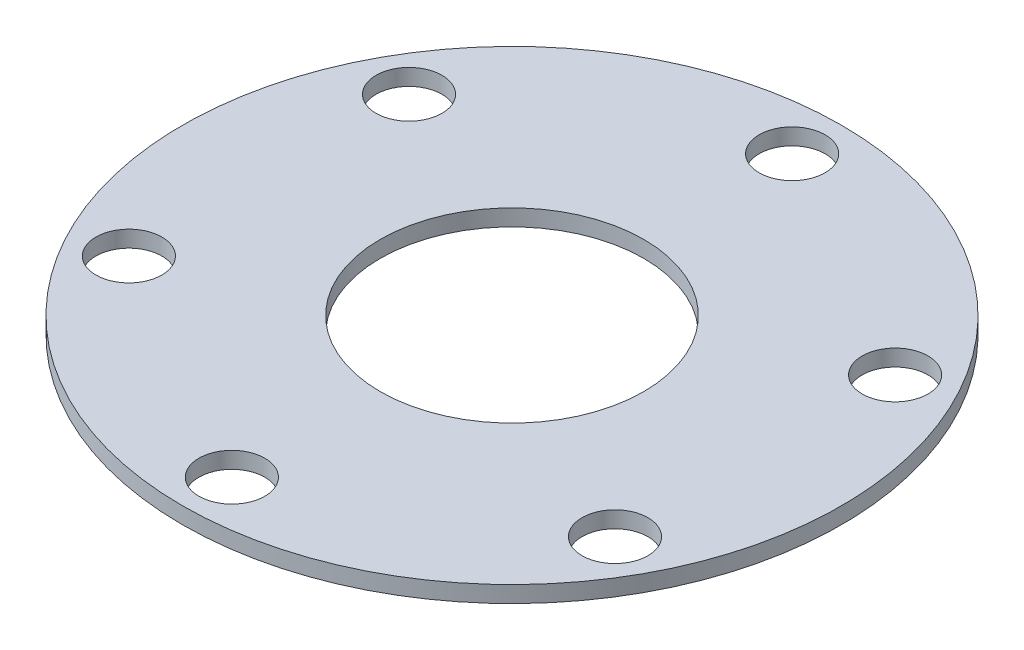
ISO-10303-21;
HEADER;
FILE_DESCRIPTION(('STEP AP214'),'2;1');
FILE_NAME('part.step','',(''),(''),'','','');
FILE_SCHEMA(('AUTOMOTIVE_DESIGN { 1 0 10303 214 1 1 1 1 }'));
ENDSEC;
DATA;
#1=APPLICATION_CONTEXT('core data for automotive mechanical design processes');
#2=APPLICATION_PROTOCOL_DEFINITION('international standard','automotive_design',2000,#1);
#3=PRODUCT_CONTEXT('',#1,'mechanical');
#4=PRODUCT('Part','Part','',(#3));
#5=PRODUCT_RELATED_PRODUCT_CATEGORY('part','',(#4));
#6=PRODUCT_DEFINITION_FORMATION('','',#4);
#7=PRODUCT_DEFINITION_CONTEXT('part definition',#1,'design');
#8=PRODUCT_DEFINITION('design','',#6,#7);
#9=PRODUCT_DEFINITION_SHAPE('','',#8);
#10=(LENGTH_UNIT() NAMED_UNIT(*) SI_UNIT(.MILLI.,.METRE.));
#11=(NAMED_UNIT(*) PLANE_ANGLE_UNIT() SI_UNIT($,.RADIAN.));
#12=(NAMED_UNIT(*) SI_UNIT($,.STERADIAN.) SOLID_ANGLE_UNIT());
#13=UNCERTAINTY_MEASURE_WITH_UNIT(LENGTH_MEASURE(1.E-05),#10,'distance_accuracy_value','');
#14=(GEOMETRIC_REPRESENTATION_CONTEXT(3) GLOBAL_UNCERTAINTY_ASSIGNED_CONTEXT((#13)) GLOBAL_UNIT_ASSIGNED_CONTEXT((#10,
#11,#12)) REPRESENTATION_CONTEXT('',''));
#15=CARTESIAN_POINT('',(0.,0.,0.));
#16=DIRECTION('',(0.,0.,1.));
#17=DIRECTION('',(1.,0.,0.));
#18=AXIS2_PLACEMENT_3D('',#15,#16,#17);
#19=CARTESIAN_POINT('',(0.,6.35,0.));
#20=DIRECTION('',(0.,-1.,0.));
#21=DIRECTION('',(0.,0.,-1.));
#22=AXIS2_PLACEMENT_3D('',#19,#20,#21);
#23=CYLINDRICAL_SURFACE('',#22,127.);
#24=CARTESIAN_POINT('',(0.,6.35,0.));
#25=DIRECTION('',(0.,1.,0.));
#26=DIRECTION('',(0.,0.,1.));
#27=AXIS2_PLACEMENT_3D('',#24,#25,#26);
#28=CIRCLE('',#27,127.);
#29=CARTESIAN_POINT('',(0.,6.35,127.));
#30=VERTEX_POINT('',#29);
#31=EDGE_CURVE('E10',#30,#30,#28,.T.);
#32=ORIENTED_EDGE('',*,*,#31,.F.);
#33=EDGE_LOOP('',(#32));
#34=FACE_BOUND('',#33,.T.);
#35=CARTESIAN_POINT('',(0.,0.,0.));
#36=DIRECTION('',(0.,1.,0.));
#37=DIRECTION('',(0.,0.,1.));
#38=AXIS2_PLACEMENT_3D('',#35,#36,#37);
#39=CIRCLE('',#38,127.);
#40=CARTESIAN_POINT('',(0.,0.,127.));
#41=VERTEX_POINT('',#40);
#42=EDGE_CURVE('E38',#41,#41,#39,.T.);
#43=ORIENTED_EDGE('',*,*,#42,.T.);
#44=EDGE_LOOP('',(#43));
#45=FACE_BOUND('',#44,.T.);
#46=ADVANCED_FACE('F31',(#34,#45),#23,.T.);
#47=CARTESIAN_POINT('',(0.,6.35,0.));
#48=DIRECTION('',(0.,1.,0.));
#49=DIRECTION('',(0.,0.,1.));
#50=AXIS2_PLACEMENT_3D('',#47,#48,#49);
#51=PLANE('',#50);
#52=CARTESIAN_POINT('',(0.,6.35,-107.95));
#53=DIRECTION('',(0.,1.,0.));
#54=DIRECTION('',(0.,0.,1.));
#55=AXIS2_PLACEMENT_3D('',#52,#53,#54);
#56=CIRCLE('',#55,12.7);
#57=CARTESIAN_POINT('',(0.,6.35,-95.25));
#58=VERTEX_POINT('',#57);
#59=EDGE_CURVE('E53',#58,#58,#56,.T.);
#60=ORIENTED_EDGE('',*,*,#59,.F.);
#61=EDGE_LOOP('',(#60));
#62=FACE_BOUND('',#61,.T.);
#63=CARTESIAN_POINT('',(93.6625,6.35,53.975));
#64=DIRECTION('',(0.,1.,0.));
#65=DIRECTION('',(0.,0.,1.));
#66=AXIS2_PLACEMENT_3D('',#63,#64,#65);
#67=CIRCLE('',#66,12.7);
#68=CARTESIAN_POINT('',(93.6625,6.35,66.675));
#69=VERTEX_POINT('',#68);
#70=EDGE_CURVE('E79',#69,#69,#67,.T.);
#71=ORIENTED_EDGE('',*,*,#70,.F.);
#72=EDGE_LOOP('',(#71));
#73=FACE_BOUND('',#72,.T.);
#74=CARTESIAN_POINT('',(-93.6625,6.35,53.975));
#75=DIRECTION('',(0.,1.,0.));
#76=DIRECTION('',(0.,0.,1.));
#77=AXIS2_PLACEMENT_3D('',#74,#75,#76);
#78=CIRCLE('',#77,12.7);
#79=CARTESIAN_POINT('',(-93.6625,6.35,66.675));
#80=VERTEX_POINT('',#79);
#81=EDGE_CURVE('E75',#80,#80,#78,.T.);
#82=ORIENTED_EDGE('',*,*,#81,.F.);
#83=EDGE_LOOP('',(#82));
#84=FACE_BOUND('',#83,.T.);
#85=CARTESIAN_POINT('',(-93.6625,6.35,-53.975));
#86=DIRECTION('',(0.,1.,0.));
#87=DIRECTION('',(0.,0.,1.));
#88=AXIS2_PLACEMENT_3D('',#85,#86,#87);
#89=CIRCLE('',#88,12.7);
#90=CARTESIAN_POINT('',(-93.6625,6.35,-41.275));
#91=VERTEX_POINT('',#90);
#92=EDGE_CURVE('E78',#91,#91,#89,.T.);
#93=ORIENTED_EDGE('',*,*,#92,.F.);
#94=EDGE_LOOP('',(#93));
#95=FACE_BOUND('',#94,.T.);
#96=CARTESIAN_POINT('',(0.,6.35,107.95));
#97=DIRECTION('',(0.,1.,0.));
#98=DIRECTION('',(0.,0.,1.));
#99=AXIS2_PLACEMENT_3D('',#96,#97,#98);
#100=CIRCLE('',#99,12.7);
#101=CARTESIAN_POINT('',(0.,6.35,120.65));
#102=VERTEX_POINT('',#101);
#103=EDGE_CURVE('E82',#102,#102,#100,.T.);
#104=ORIENTED_EDGE('',*,*,#103,.F.);
#105=EDGE_LOOP('',(#104));
#106=FACE_BOUND('',#105,.T.);
#107=CARTESIAN_POINT('',(93.6625,6.35,-53.975));
#108=DIRECTION('',(0.,1.,0.));
#109=DIRECTION('',(0.,0.,1.));
#110=AXIS2_PLACEMENT_3D('',#107,#108,#109);
#111=CIRCLE('',#110,12.7);
#112=CARTESIAN_POINT('',(93.6625,6.35,-41.275));
#113=VERTEX_POINT('',#112);
#114=EDGE_CURVE('E85',#113,#113,#111,.T.);
#115=ORIENTED_EDGE('',*,*,#114,.F.);
#116=EDGE_LOOP('',(#115));
#117=FACE_BOUND('',#116,.T.);
#118=CARTESIAN_POINT('',(0.,6.35,0.));
#119=DIRECTION('',(0.,1.,0.));
#120=DIRECTION('',(0.,0.,1.));
#121=AXIS2_PLACEMENT_3D('',#118,#119,#120);
#122=CIRCLE('',#121,50.8);
#123=CARTESIAN_POINT('',(0.,6.35,50.8));
#124=VERTEX_POINT('',#123);
#125=EDGE_CURVE('E46',#124,#124,#122,.T.);
#126=ORIENTED_EDGE('',*,*,#125,.F.);
#127=EDGE_LOOP('',(#126));
#128=FACE_BOUND('',#127,.T.);
#129=ORIENTED_EDGE('',*,*,#31,.T.);
#130=EDGE_LOOP('',(#129));
#131=FACE_BOUND('',#130,.T.);
#132=ADVANCED_FACE('F96',(#62,#73,#84,#95,#106,#117,#128,#131),#51,.T.);
#133=CARTESIAN_POINT('',(0.,0.,0.));
#134=DIRECTION('',(0.,1.,0.));
#135=DIRECTION('',(0.,0.,1.));
#136=AXIS2_PLACEMENT_3D('',#133,#134,#135);
#137=PLANE('',#136);
#138=CARTESIAN_POINT('',(0.,0.,-107.95));
#139=DIRECTION('',(0.,1.,0.));
#140=DIRECTION('',(0.,0.,1.));
#141=AXIS2_PLACEMENT_3D('',#138,#139,#140);
#142=CIRCLE('',#141,12.7);
#143=CARTESIAN_POINT('',(0.,0.,-95.25));
#144=VERTEX_POINT('',#143);
#145=EDGE_CURVE('E34',#144,#144,#142,.T.);
#146=ORIENTED_EDGE('',*,*,#145,.T.);
#147=EDGE_LOOP('',(#146));
#148=FACE_BOUND('',#147,.T.);
#149=CARTESIAN_POINT('',(93.6625,0.,53.975));
#150=DIRECTION('',(0.,1.,0.));
#151=DIRECTION('',(0.,0.,1.));
#152=AXIS2_PLACEMENT_3D('',#149,#150,#151);
#153=CIRCLE('',#152,12.7);
#154=CARTESIAN_POINT('',(93.6625,0.,66.675));
#155=VERTEX_POINT('',#154);
#156=EDGE_CURVE('E61',#155,#155,#153,.T.);
#157=ORIENTED_EDGE('',*,*,#156,.T.);
#158=EDGE_LOOP('',(#157));
#159=FACE_BOUND('',#158,.T.);
#160=CARTESIAN_POINT('',(-93.6625,0.,53.975));
#161=DIRECTION('',(0.,1.,0.));
#162=DIRECTION('',(0.,0.,1.));
#163=AXIS2_PLACEMENT_3D('',#160,#161,#162);
#164=CIRCLE('',#163,12.7);
#165=CARTESIAN_POINT('',(-93.6625,0.,66.675));
#166=VERTEX_POINT('',#165);
#167=EDGE_CURVE('E59',#166,#166,#164,.T.);
#168=ORIENTED_EDGE('',*,*,#167,.T.);
#169=EDGE_LOOP('',(#168));
#170=FACE_BOUND('',#169,.T.);
#171=CARTESIAN_POINT('',(-93.6625,0.,-53.975));
#172=DIRECTION('',(0.,1.,0.));
#173=DIRECTION('',(0.,0.,1.));
#174=AXIS2_PLACEMENT_3D('',#171,#172,#173);
#175=CIRCLE('',#174,12.7);
#176=CARTESIAN_POINT('',(-93.6625,0.,-41.275));
#177=VERTEX_POINT('',#176);
#178=EDGE_CURVE('E56',#177,#177,#175,.T.);
#179=ORIENTED_EDGE('',*,*,#178,.T.);
#180=EDGE_LOOP('',(#179));
#181=FACE_BOUND('',#180,.T.);
#182=CARTESIAN_POINT('',(0.,0.,107.95));
#183=DIRECTION('',(0.,1.,0.));
#184=DIRECTION('',(0.,0.,1.));
#185=AXIS2_PLACEMENT_3D('',#182,#183,#184);
#186=CIRCLE('',#185,12.7);
#187=CARTESIAN_POINT('',(0.,0.,120.65));
#188=VERTEX_POINT('',#187);
#189=EDGE_CURVE('E52',#188,#188,#186,.T.);
#190=ORIENTED_EDGE('',*,*,#189,.T.);
#191=EDGE_LOOP('',(#190));
#192=FACE_BOUND('',#191,.T.);
#193=CARTESIAN_POINT('',(93.6625,0.,-53.975));
#194=DIRECTION('',(0.,1.,0.));
#195=DIRECTION('',(0.,0.,1.));
#196=AXIS2_PLACEMENT_3D('',#193,#194,#195);
#197=CIRCLE('',#196,12.7);
#198=CARTESIAN_POINT('',(93.6625,0.,-41.275));
#199=VERTEX_POINT('',#198);
#200=EDGE_CURVE('E49',#199,#199,#197,.T.);
#201=ORIENTED_EDGE('',*,*,#200,.T.);
#202=EDGE_LOOP('',(#201));
#203=FACE_BOUND('',#202,.T.);
#204=CARTESIAN_POINT('',(0.,0.,0.));
#205=DIRECTION('',(0.,1.,0.));
#206=DIRECTION('',(0.,0.,1.));
#207=AXIS2_PLACEMENT_3D('',#204,#205,#206);
#208=CIRCLE('',#207,50.8);
#209=CARTESIAN_POINT('',(0.,0.,50.8));
#210=VERTEX_POINT('',#209);
#211=EDGE_CURVE('E43',#210,#210,#208,.T.);
#212=ORIENTED_EDGE('',*,*,#211,.T.);
#213=EDGE_LOOP('',(#212));
#214=FACE_BOUND('',#213,.T.);
#215=ORIENTED_EDGE('',*,*,#42,.F.);
#216=EDGE_LOOP('',(#215));
#217=FACE_BOUND('',#216,.T.);
#218=ADVANCED_FACE('F99',(#148,#159,#170,#181,#192,#203,#214,#217),#137,.F.);
#219=CARTESIAN_POINT('',(0.,0.,0.));
#220=DIRECTION('',(0.,1.,0.));
#221=DIRECTION('',(0.,0.,1.));
#222=AXIS2_PLACEMENT_3D('',#219,#220,#221);
#223=CYLINDRICAL_SURFACE('',#222,50.8);
#224=ORIENTED_EDGE('',*,*,#211,.F.);
#225=EDGE_LOOP('',(#224));
#226=FACE_BOUND('',#225,.T.);
#227=ORIENTED_EDGE('',*,*,#125,.T.);
#228=EDGE_LOOP('',(#227));
#229=FACE_BOUND('',#228,.T.);
#230=ADVANCED_FACE('F116',(#226,#229),#223,.F.);
#231=CARTESIAN_POINT('',(93.6625,-6.35,-53.975));
#232=DIRECTION('',(0.,1.,0.));
#233=DIRECTION('',(0.,0.,1.));
#234=AXIS2_PLACEMENT_3D('',#231,#232,#233);
#235=CYLINDRICAL_SURFACE('',#234,12.7);
#236=ORIENTED_EDGE('',*,*,#114,.T.);
#237=EDGE_LOOP('',(#236));
#238=FACE_BOUND('',#237,.T.);
#239=ORIENTED_EDGE('',*,*,#200,.F.);
#240=EDGE_LOOP('',(#239));
#241=FACE_BOUND('',#240,.T.);
#242=ADVANCED_FACE('F112',(#238,#241),#235,.F.);
#243=CARTESIAN_POINT('',(0.,-6.35,107.95));
#244=DIRECTION('',(0.,1.,0.));
#245=DIRECTION('',(0.,0.,1.));
#246=AXIS2_PLACEMENT_3D('',#243,#244,#245);
#247=CYLINDRICAL_SURFACE('',#246,12.7);
#248=ORIENTED_EDGE('',*,*,#103,.T.);
#249=EDGE_LOOP('',(#248));
#250=FACE_BOUND('',#249,.T.);
#251=ORIENTED_EDGE('',*,*,#189,.F.);
#252=EDGE_LOOP('',(#251));
#253=FACE_BOUND('',#252,.T.);
#254=ADVANCED_FACE('F115',(#250,#253),#247,.F.);
#255=CARTESIAN_POINT('',(-93.6625,-6.35,-53.975));
#256=DIRECTION('',(0.,1.,0.));
#257=DIRECTION('',(0.,0.,1.));
#258=AXIS2_PLACEMENT_3D('',#255,#256,#257);
#259=CYLINDRICAL_SURFACE('',#258,12.7);
#260=ORIENTED_EDGE('',*,*,#92,.T.);
#261=EDGE_LOOP('',(#260));
#262=FACE_BOUND('',#261,.T.);
#263=ORIENTED_EDGE('',*,*,#178,.F.);
#264=EDGE_LOOP('',(#263));
#265=FACE_BOUND('',#264,.T.);
#266=ADVANCED_FACE('F153',(#262,#265),#259,.F.);
#267=CARTESIAN_POINT('',(-93.6625,-6.35,53.975));
#268=DIRECTION('',(0.,1.,0.));
#269=DIRECTION('',(0.,0.,1.));
#270=AXIS2_PLACEMENT_3D('',#267,#268,#269);
#271=CYLINDRICAL_SURFACE('',#270,12.7);
#272=ORIENTED_EDGE('',*,*,#81,.T.);
#273=EDGE_LOOP('',(#272));
#274=FACE_BOUND('',#273,.T.);
#275=ORIENTED_EDGE('',*,*,#167,.F.);
#276=EDGE_LOOP('',(#275));
#277=FACE_BOUND('',#276,.T.);
#278=ADVANCED_FACE('F161',(#274,#277),#271,.F.);
#279=CARTESIAN_POINT('',(93.6625,-6.35,53.975));
#280=DIRECTION('',(0.,1.,0.));
#281=DIRECTION('',(0.,0.,1.));
#282=AXIS2_PLACEMENT_3D('',#279,#280,#281);
#283=CYLINDRICAL_SURFACE('',#282,12.7);
#284=ORIENTED_EDGE('',*,*,#70,.T.);
#285=EDGE_LOOP('',(#284));
#286=FACE_BOUND('',#285,.T.);
#287=ORIENTED_EDGE('',*,*,#156,.F.);
#288=EDGE_LOOP('',(#287));
#289=FACE_BOUND('',#288,.T.);
#290=ADVANCED_FACE('F169',(#286,#289),#283,.F.);
#291=CARTESIAN_POINT('',(0.,-6.35,-107.95));
#292=DIRECTION('',(0.,1.,0.));
#293=DIRECTION('',(0.,0.,1.));
#294=AXIS2_PLACEMENT_3D('',#291,#292,#293);
#295=CYLINDRICAL_SURFACE('',#294,12.7);
#296=ORIENTED_EDGE('',*,*,#59,.T.);
#297=EDGE_LOOP('',(#296));
#298=FACE_BOUND('',#297,.T.);
#299=ORIENTED_EDGE('',*,*,#145,.F.);
#300=EDGE_LOOP('',(#299));
#301=FACE_BOUND('',#300,.T.);
#302=ADVANCED_FACE('F93',(#298,#301),#295,.F.);
#303=CLOSED_SHELL('',(#46,#132,#218,#230,#242,#254,#266,#278,#290,#302));
#304=MANIFOLD_SOLID_BREP('B2',#303);
#305=ADVANCED_BREP_SHAPE_REPRESENTATION('',(#18,#304),#14);
#306=SHAPE_DEFINITION_REPRESENTATION(#9,#305);
ENDSEC;
END-ISO-10303-21;
